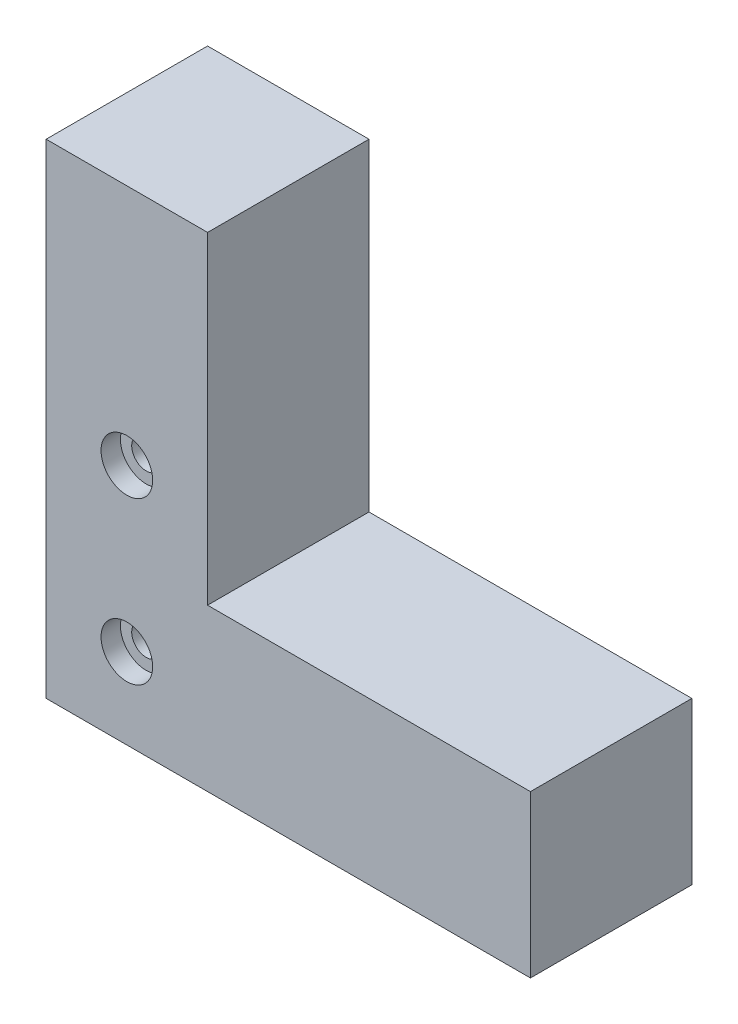
ISO-10303-21;
HEADER;
FILE_DESCRIPTION(('STEP AP214'),'2;1');
FILE_NAME('part.step','',(''),(''),'','','');
FILE_SCHEMA(('AUTOMOTIVE_DESIGN { 1 0 10303 214 1 1 1 1 }'));
ENDSEC;
DATA;
#1=APPLICATION_CONTEXT('core data for automotive mechanical design processes');
#2=APPLICATION_PROTOCOL_DEFINITION('international standard','automotive_design',2000,#1);
#3=PRODUCT_CONTEXT('',#1,'mechanical');
#4=PRODUCT('Part','Part','',(#3));
#5=PRODUCT_RELATED_PRODUCT_CATEGORY('part','',(#4));
#6=PRODUCT_DEFINITION_FORMATION('','',#4);
#7=PRODUCT_DEFINITION_CONTEXT('part definition',#1,'design');
#8=PRODUCT_DEFINITION('design','',#6,#7);
#9=PRODUCT_DEFINITION_SHAPE('','',#8);
#10=(LENGTH_UNIT() NAMED_UNIT(*) SI_UNIT(.MILLI.,.METRE.));
#11=(NAMED_UNIT(*) PLANE_ANGLE_UNIT() SI_UNIT($,.RADIAN.));
#12=(NAMED_UNIT(*) SI_UNIT($,.STERADIAN.) SOLID_ANGLE_UNIT());
#13=UNCERTAINTY_MEASURE_WITH_UNIT(LENGTH_MEASURE(1.E-05),#10,'distance_accuracy_value','');
#14=(GEOMETRIC_REPRESENTATION_CONTEXT(3) GLOBAL_UNCERTAINTY_ASSIGNED_CONTEXT((#13)) GLOBAL_UNIT_ASSIGNED_CONTEXT((#10,
#11,#12)) REPRESENTATION_CONTEXT('',''));
#15=CARTESIAN_POINT('',(0.,0.,0.));
#16=DIRECTION('',(0.,0.,1.));
#17=DIRECTION('',(1.,0.,0.));
#18=AXIS2_PLACEMENT_3D('',#15,#16,#17);
#19=CARTESIAN_POINT('',(-12.5,-12.5,0.));
#20=DIRECTION('',(0.,0.,1.));
#21=DIRECTION('',(1.,0.,0.));
#22=AXIS2_PLACEMENT_3D('',#19,#20,#21);
#23=CYLINDRICAL_SURFACE('',#22,2.25);
#24=CARTESIAN_POINT('',(-12.5,-12.5,0.));
#25=DIRECTION('',(0.,0.,1.));
#26=DIRECTION('',(1.,0.,0.));
#27=AXIS2_PLACEMENT_3D('',#24,#25,#26);
#28=CIRCLE('',#27,2.25);
#29=CARTESIAN_POINT('',(-10.25,-12.5,0.));
#30=VERTEX_POINT('',#29);
#31=EDGE_CURVE('E124',#30,#30,#28,.T.);
#32=ORIENTED_EDGE('',*,*,#31,.F.);
#33=EDGE_LOOP('',(#32));
#34=FACE_BOUND('',#33,.T.);
#35=CARTESIAN_POINT('',(-12.5,-12.5,22.));
#36=DIRECTION('',(0.,0.,1.));
#37=DIRECTION('',(1.,0.,0.));
#38=AXIS2_PLACEMENT_3D('',#35,#36,#37);
#39=CIRCLE('',#38,2.25);
#40=CARTESIAN_POINT('',(-10.25,-12.5,22.));
#41=VERTEX_POINT('',#40);
#42=EDGE_CURVE('E37',#41,#41,#39,.F.);
#43=ORIENTED_EDGE('',*,*,#42,.F.);
#44=EDGE_LOOP('',(#43));
#45=FACE_BOUND('',#44,.T.);
#46=ADVANCED_FACE('F33',(#34,#45),#23,.F.);
#47=CARTESIAN_POINT('',(-12.5,12.5,0.));
#48=DIRECTION('',(0.,0.,1.));
#49=DIRECTION('',(1.,0.,0.));
#50=AXIS2_PLACEMENT_3D('',#47,#48,#49);
#51=CYLINDRICAL_SURFACE('',#50,2.25);
#52=CARTESIAN_POINT('',(-12.5,12.5,0.));
#53=DIRECTION('',(0.,0.,1.));
#54=DIRECTION('',(1.,0.,0.));
#55=AXIS2_PLACEMENT_3D('',#52,#53,#54);
#56=CIRCLE('',#55,2.25);
#57=CARTESIAN_POINT('',(-10.25,12.5,0.));
#58=VERTEX_POINT('',#57);
#59=EDGE_CURVE('E138',#58,#58,#56,.T.);
#60=ORIENTED_EDGE('',*,*,#59,.F.);
#61=EDGE_LOOP('',(#60));
#62=FACE_BOUND('',#61,.T.);
#63=CARTESIAN_POINT('',(-12.5,12.5,22.));
#64=DIRECTION('',(0.,0.,1.));
#65=DIRECTION('',(1.,0.,0.));
#66=AXIS2_PLACEMENT_3D('',#63,#64,#65);
#67=CIRCLE('',#66,2.25);
#68=CARTESIAN_POINT('',(-10.25,12.5,22.));
#69=VERTEX_POINT('',#68);
#70=EDGE_CURVE('E136',#69,#69,#67,.F.);
#71=ORIENTED_EDGE('',*,*,#70,.F.);
#72=EDGE_LOOP('',(#71));
#73=FACE_BOUND('',#72,.T.);
#74=ADVANCED_FACE('F181',(#62,#73),#51,.F.);
#75=CARTESIAN_POINT('',(0.,0.,25.));
#76=DIRECTION('',(0.,-1.,0.));
#77=DIRECTION('',(0.,0.,-1.));
#78=AXIS2_PLACEMENT_3D('',#75,#76,#77);
#79=PLANE('',#78);
#80=DIRECTION('',(-1.,0.,0.));
#81=VECTOR('',#80,1.);
#82=CARTESIAN_POINT('',(0.,0.,0.));
#83=LINE('',#82,#81);
#84=CARTESIAN_POINT('',(50.,0.,0.));
#85=VERTEX_POINT('',#84);
#86=CARTESIAN_POINT('',(0.,0.,0.));
#87=VERTEX_POINT('',#86);
#88=EDGE_CURVE('E120',#85,#87,#83,.T.);
#89=ORIENTED_EDGE('',*,*,#88,.T.);
#90=DIRECTION('',(0.,0.,-1.));
#91=VECTOR('',#90,1.);
#92=CARTESIAN_POINT('',(0.,0.,25.));
#93=LINE('',#92,#91);
#94=CARTESIAN_POINT('',(0.,0.,25.));
#95=VERTEX_POINT('',#94);
#96=EDGE_CURVE('E11',#95,#87,#93,.T.);
#97=ORIENTED_EDGE('',*,*,#96,.F.);
#98=DIRECTION('',(-1.,0.,0.));
#99=VECTOR('',#98,1.);
#100=CARTESIAN_POINT('',(0.,0.,25.));
#101=LINE('',#100,#99);
#102=CARTESIAN_POINT('',(50.,0.,25.));
#103=VERTEX_POINT('',#102);
#104=EDGE_CURVE('E131',#103,#95,#101,.T.);
#105=ORIENTED_EDGE('',*,*,#104,.F.);
#106=DIRECTION('',(0.,0.,-1.));
#107=VECTOR('',#106,1.);
#108=CARTESIAN_POINT('',(50.,0.,25.));
#109=LINE('',#108,#107);
#110=EDGE_CURVE('E116',#103,#85,#109,.T.);
#111=ORIENTED_EDGE('',*,*,#110,.T.);
#112=EDGE_LOOP('',(#89,#97,#105,#111));
#113=FACE_BOUND('',#112,.T.);
#114=ADVANCED_FACE('F35',(#113),#79,.F.);
#115=CARTESIAN_POINT('',(0.,0.,25.));
#116=DIRECTION('',(-1.,0.,0.));
#117=DIRECTION('',(0.,0.,1.));
#118=AXIS2_PLACEMENT_3D('',#115,#116,#117);
#119=PLANE('',#118);
#120=DIRECTION('',(0.,1.,0.));
#121=VECTOR('',#120,1.);
#122=CARTESIAN_POINT('',(0.,0.,0.));
#123=LINE('',#122,#121);
#124=CARTESIAN_POINT('',(0.,50.,0.));
#125=VERTEX_POINT('',#124);
#126=EDGE_CURVE('E123',#87,#125,#123,.T.);
#127=ORIENTED_EDGE('',*,*,#126,.T.);
#128=DIRECTION('',(0.,0.,-1.));
#129=VECTOR('',#128,1.);
#130=CARTESIAN_POINT('',(0.,50.,25.));
#131=LINE('',#130,#129);
#132=CARTESIAN_POINT('',(0.,50.,25.));
#133=VERTEX_POINT('',#132);
#134=EDGE_CURVE('E43',#133,#125,#131,.T.);
#135=ORIENTED_EDGE('',*,*,#134,.F.);
#136=DIRECTION('',(0.,1.,0.));
#137=VECTOR('',#136,1.);
#138=CARTESIAN_POINT('',(0.,0.,25.));
#139=LINE('',#138,#137);
#140=EDGE_CURVE('E89',#95,#133,#139,.T.);
#141=ORIENTED_EDGE('',*,*,#140,.F.);
#142=ORIENTED_EDGE('',*,*,#96,.T.);
#143=EDGE_LOOP('',(#127,#135,#141,#142));
#144=FACE_BOUND('',#143,.T.);
#145=ADVANCED_FACE('F160',(#144),#119,.F.);
#146=CARTESIAN_POINT('',(0.,50.,25.));
#147=DIRECTION('',(0.,-1.,0.));
#148=DIRECTION('',(0.,0.,-1.));
#149=AXIS2_PLACEMENT_3D('',#146,#147,#148);
#150=PLANE('',#149);
#151=DIRECTION('',(-1.,0.,0.));
#152=VECTOR('',#151,1.);
#153=CARTESIAN_POINT('',(0.,50.,0.));
#154=LINE('',#153,#152);
#155=CARTESIAN_POINT('',(-25.,50.,0.));
#156=VERTEX_POINT('',#155);
#157=EDGE_CURVE('E126',#125,#156,#154,.T.);
#158=ORIENTED_EDGE('',*,*,#157,.T.);
#159=DIRECTION('',(0.,0.,-1.));
#160=VECTOR('',#159,1.);
#161=CARTESIAN_POINT('',(-25.,50.,25.));
#162=LINE('',#161,#160);
#163=CARTESIAN_POINT('',(-25.,50.,25.));
#164=VERTEX_POINT('',#163);
#165=EDGE_CURVE('E111',#164,#156,#162,.T.);
#166=ORIENTED_EDGE('',*,*,#165,.F.);
#167=DIRECTION('',(-1.,0.,0.));
#168=VECTOR('',#167,1.);
#169=CARTESIAN_POINT('',(0.,50.,25.));
#170=LINE('',#169,#168);
#171=EDGE_CURVE('E102',#133,#164,#170,.T.);
#172=ORIENTED_EDGE('',*,*,#171,.F.);
#173=ORIENTED_EDGE('',*,*,#134,.T.);
#174=EDGE_LOOP('',(#158,#166,#172,#173));
#175=FACE_BOUND('',#174,.T.);
#176=ADVANCED_FACE('F163',(#175),#150,.F.);
#177=CARTESIAN_POINT('',(-25.,-25.,25.));
#178=DIRECTION('',(1.,0.,0.));
#179=DIRECTION('',(0.,0.,-1.));
#180=AXIS2_PLACEMENT_3D('',#177,#178,#179);
#181=PLANE('',#180);
#182=DIRECTION('',(0.,-1.,0.));
#183=VECTOR('',#182,1.);
#184=CARTESIAN_POINT('',(-25.,-25.,0.));
#185=LINE('',#184,#183);
#186=CARTESIAN_POINT('',(-25.,-25.,0.));
#187=VERTEX_POINT('',#186);
#188=EDGE_CURVE('E110',#156,#187,#185,.T.);
#189=ORIENTED_EDGE('',*,*,#188,.T.);
#190=DIRECTION('',(0.,0.,-1.));
#191=VECTOR('',#190,1.);
#192=CARTESIAN_POINT('',(-25.,-25.,25.));
#193=LINE('',#192,#191);
#194=CARTESIAN_POINT('',(-25.,-25.,25.));
#195=VERTEX_POINT('',#194);
#196=EDGE_CURVE('E107',#195,#187,#193,.T.);
#197=ORIENTED_EDGE('',*,*,#196,.F.);
#198=DIRECTION('',(0.,-1.,0.));
#199=VECTOR('',#198,1.);
#200=CARTESIAN_POINT('',(-25.,-25.,25.));
#201=LINE('',#200,#199);
#202=EDGE_CURVE('E96',#164,#195,#201,.T.);
#203=ORIENTED_EDGE('',*,*,#202,.F.);
#204=ORIENTED_EDGE('',*,*,#165,.T.);
#205=EDGE_LOOP('',(#189,#197,#203,#204));
#206=FACE_BOUND('',#205,.T.);
#207=ADVANCED_FACE('F108',(#206),#181,.F.);
#208=CARTESIAN_POINT('',(-25.,-25.,25.));
#209=DIRECTION('',(0.,1.,0.));
#210=DIRECTION('',(-1.,0.,0.));
#211=AXIS2_PLACEMENT_3D('',#208,#209,#210);
#212=PLANE('',#211);
#213=DIRECTION('',(1.,0.,0.));
#214=VECTOR('',#213,1.);
#215=CARTESIAN_POINT('',(-25.,-25.,0.));
#216=LINE('',#215,#214);
#217=CARTESIAN_POINT('',(50.,-25.,0.));
#218=VERTEX_POINT('',#217);
#219=EDGE_CURVE('E75',#187,#218,#216,.T.);
#220=ORIENTED_EDGE('',*,*,#219,.T.);
#221=DIRECTION('',(0.,0.,-1.));
#222=VECTOR('',#221,1.);
#223=CARTESIAN_POINT('',(50.,-25.,25.));
#224=LINE('',#223,#222);
#225=CARTESIAN_POINT('',(50.,-25.,25.));
#226=VERTEX_POINT('',#225);
#227=EDGE_CURVE('E112',#226,#218,#224,.T.);
#228=ORIENTED_EDGE('',*,*,#227,.F.);
#229=DIRECTION('',(1.,0.,0.));
#230=VECTOR('',#229,1.);
#231=CARTESIAN_POINT('',(-25.,-25.,25.));
#232=LINE('',#231,#230);
#233=EDGE_CURVE('E100',#195,#226,#232,.T.);
#234=ORIENTED_EDGE('',*,*,#233,.F.);
#235=ORIENTED_EDGE('',*,*,#196,.T.);
#236=EDGE_LOOP('',(#220,#228,#234,#235));
#237=FACE_BOUND('',#236,.T.);
#238=ADVANCED_FACE('F114',(#237),#212,.F.);
#239=CARTESIAN_POINT('',(50.,0.,25.));
#240=DIRECTION('',(-1.,0.,0.));
#241=DIRECTION('',(0.,0.,1.));
#242=AXIS2_PLACEMENT_3D('',#239,#240,#241);
#243=PLANE('',#242);
#244=DIRECTION('',(0.,1.,0.));
#245=VECTOR('',#244,1.);
#246=CARTESIAN_POINT('',(50.,0.,0.));
#247=LINE('',#246,#245);
#248=EDGE_CURVE('E81',#218,#85,#247,.T.);
#249=ORIENTED_EDGE('',*,*,#248,.T.);
#250=ORIENTED_EDGE('',*,*,#110,.F.);
#251=DIRECTION('',(0.,1.,0.));
#252=VECTOR('',#251,1.);
#253=CARTESIAN_POINT('',(50.,0.,25.));
#254=LINE('',#253,#252);
#255=EDGE_CURVE('E52',#226,#103,#254,.T.);
#256=ORIENTED_EDGE('',*,*,#255,.F.);
#257=ORIENTED_EDGE('',*,*,#227,.T.);
#258=EDGE_LOOP('',(#249,#250,#256,#257));
#259=FACE_BOUND('',#258,.T.);
#260=ADVANCED_FACE('F168',(#259),#243,.F.);
#261=CARTESIAN_POINT('',(0.,0.,25.));
#262=DIRECTION('',(0.,0.,-1.));
#263=DIRECTION('',(-1.,0.,0.));
#264=AXIS2_PLACEMENT_3D('',#261,#262,#263);
#265=PLANE('',#264);
#266=CARTESIAN_POINT('',(-12.5,-12.5,25.));
#267=DIRECTION('',(0.,0.,1.));
#268=DIRECTION('',(1.,0.,0.));
#269=AXIS2_PLACEMENT_3D('',#266,#267,#268);
#270=CIRCLE('',#269,4.);
#271=CARTESIAN_POINT('',(-8.5,-12.5,25.));
#272=VERTEX_POINT('',#271);
#273=EDGE_CURVE('E152',#272,#272,#270,.T.);
#274=ORIENTED_EDGE('',*,*,#273,.F.);
#275=EDGE_LOOP('',(#274));
#276=FACE_BOUND('',#275,.T.);
#277=CARTESIAN_POINT('',(-12.5,12.5,25.));
#278=DIRECTION('',(0.,0.,1.));
#279=DIRECTION('',(1.,0.,0.));
#280=AXIS2_PLACEMENT_3D('',#277,#278,#279);
#281=CIRCLE('',#280,4.);
#282=CARTESIAN_POINT('',(-8.5,12.5,25.));
#283=VERTEX_POINT('',#282);
#284=EDGE_CURVE('E145',#283,#283,#281,.T.);
#285=ORIENTED_EDGE('',*,*,#284,.F.);
#286=EDGE_LOOP('',(#285));
#287=FACE_BOUND('',#286,.T.);
#288=ORIENTED_EDGE('',*,*,#104,.T.);
#289=ORIENTED_EDGE('',*,*,#140,.T.);
#290=ORIENTED_EDGE('',*,*,#171,.T.);
#291=ORIENTED_EDGE('',*,*,#202,.T.);
#292=ORIENTED_EDGE('',*,*,#233,.T.);
#293=ORIENTED_EDGE('',*,*,#255,.T.);
#294=EDGE_LOOP('',(#288,#289,#290,#291,#292,#293));
#295=FACE_BOUND('',#294,.T.);
#296=ADVANCED_FACE('F98',(#276,#287,#295),#265,.F.);
#297=CARTESIAN_POINT('',(0.,0.,0.));
#298=DIRECTION('',(0.,0.,-1.));
#299=DIRECTION('',(-1.,0.,0.));
#300=AXIS2_PLACEMENT_3D('',#297,#298,#299);
#301=PLANE('',#300);
#302=ORIENTED_EDGE('',*,*,#59,.T.);
#303=EDGE_LOOP('',(#302));
#304=FACE_BOUND('',#303,.T.);
#305=ORIENTED_EDGE('',*,*,#31,.T.);
#306=EDGE_LOOP('',(#305));
#307=FACE_BOUND('',#306,.T.);
#308=ORIENTED_EDGE('',*,*,#88,.F.);
#309=ORIENTED_EDGE('',*,*,#248,.F.);
#310=ORIENTED_EDGE('',*,*,#219,.F.);
#311=ORIENTED_EDGE('',*,*,#188,.F.);
#312=ORIENTED_EDGE('',*,*,#157,.F.);
#313=ORIENTED_EDGE('',*,*,#126,.F.);
#314=EDGE_LOOP('',(#308,#309,#310,#311,#312,#313));
#315=FACE_BOUND('',#314,.T.);
#316=ADVANCED_FACE('F166',(#304,#307,#315),#301,.T.);
#317=CARTESIAN_POINT('',(-12.5,12.5,22.));
#318=DIRECTION('',(0.,0.,1.));
#319=DIRECTION('',(1.,0.,0.));
#320=AXIS2_PLACEMENT_3D('',#317,#318,#319);
#321=PLANE('',#320);
#322=CARTESIAN_POINT('',(-12.5,12.5,22.));
#323=DIRECTION('',(0.,0.,1.));
#324=DIRECTION('',(1.,0.,0.));
#325=AXIS2_PLACEMENT_3D('',#322,#323,#324);
#326=CIRCLE('',#325,4.);
#327=CARTESIAN_POINT('',(-8.5,12.5,22.));
#328=VERTEX_POINT('',#327);
#329=EDGE_CURVE('E139',#328,#328,#326,.T.);
#330=ORIENTED_EDGE('',*,*,#329,.T.);
#331=EDGE_LOOP('',(#330));
#332=FACE_BOUND('',#331,.T.);
#333=ORIENTED_EDGE('',*,*,#70,.T.);
#334=EDGE_LOOP('',(#333));
#335=FACE_BOUND('',#334,.T.);
#336=ADVANCED_FACE('F194',(#332,#335),#321,.T.);
#337=CARTESIAN_POINT('',(-12.5,12.5,22.));
#338=DIRECTION('',(0.,0.,1.));
#339=DIRECTION('',(1.,0.,0.));
#340=AXIS2_PLACEMENT_3D('',#337,#338,#339);
#341=CYLINDRICAL_SURFACE('',#340,4.);
#342=ORIENTED_EDGE('',*,*,#329,.F.);
#343=EDGE_LOOP('',(#342));
#344=FACE_BOUND('',#343,.T.);
#345=ORIENTED_EDGE('',*,*,#284,.T.);
#346=EDGE_LOOP('',(#345));
#347=FACE_BOUND('',#346,.T.);
#348=ADVANCED_FACE('F198',(#344,#347),#341,.F.);
#349=CARTESIAN_POINT('',(-12.5,-12.5,22.));
#350=DIRECTION('',(0.,0.,1.));
#351=DIRECTION('',(1.,0.,0.));
#352=AXIS2_PLACEMENT_3D('',#349,#350,#351);
#353=PLANE('',#352);
#354=CARTESIAN_POINT('',(-12.5,-12.5,22.));
#355=DIRECTION('',(0.,0.,1.));
#356=DIRECTION('',(1.,0.,0.));
#357=AXIS2_PLACEMENT_3D('',#354,#355,#356);
#358=CIRCLE('',#357,4.);
#359=CARTESIAN_POINT('',(-8.5,-12.5,22.));
#360=VERTEX_POINT('',#359);
#361=EDGE_CURVE('E220',#360,#360,#358,.T.);
#362=ORIENTED_EDGE('',*,*,#361,.T.);
#363=EDGE_LOOP('',(#362));
#364=FACE_BOUND('',#363,.T.);
#365=ORIENTED_EDGE('',*,*,#42,.T.);
#366=EDGE_LOOP('',(#365));
#367=FACE_BOUND('',#366,.T.);
#368=ADVANCED_FACE('F206',(#364,#367),#353,.T.);
#369=CARTESIAN_POINT('',(-12.5,-12.5,22.));
#370=DIRECTION('',(0.,0.,1.));
#371=DIRECTION('',(1.,0.,0.));
#372=AXIS2_PLACEMENT_3D('',#369,#370,#371);
#373=CYLINDRICAL_SURFACE('',#372,4.);
#374=ORIENTED_EDGE('',*,*,#361,.F.);
#375=EDGE_LOOP('',(#374));
#376=FACE_BOUND('',#375,.T.);
#377=ORIENTED_EDGE('',*,*,#273,.T.);
#378=EDGE_LOOP('',(#377));
#379=FACE_BOUND('',#378,.T.);
#380=ADVANCED_FACE('F209',(#376,#379),#373,.F.);
#381=CLOSED_SHELL('',(#46,#74,#114,#145,#176,#207,#238,#260,#296,#316,#336,#348,#368,#380));
#382=MANIFOLD_SOLID_BREP('B2',#381);
#383=ADVANCED_BREP_SHAPE_REPRESENTATION('',(#18,#382),#14);
#384=SHAPE_DEFINITION_REPRESENTATION(#9,#383);
ENDSEC;
END-ISO-10303-21;
